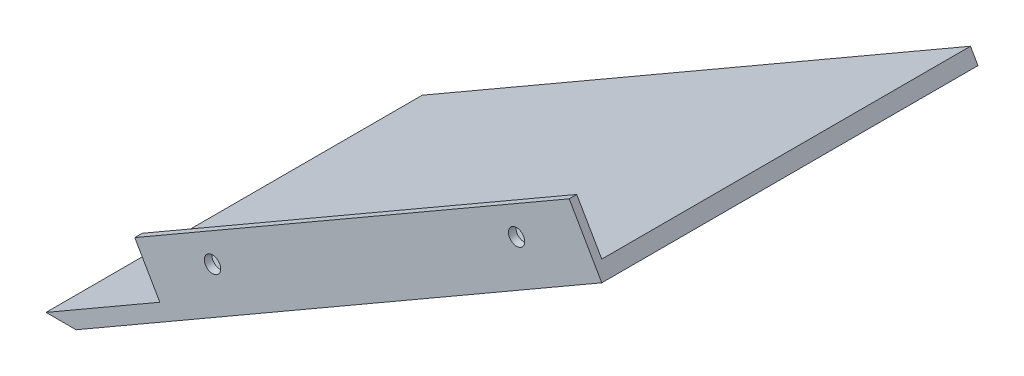
ISO-10303-21;
HEADER;
FILE_DESCRIPTION(('STEP AP214'),'2;1');
FILE_NAME('part.step','',(''),(''),'','','');
FILE_SCHEMA(('AUTOMOTIVE_DESIGN { 1 0 10303 214 1 1 1 1 }'));
ENDSEC;
DATA;
#1=APPLICATION_CONTEXT('core data for automotive mechanical design processes');
#2=APPLICATION_PROTOCOL_DEFINITION('international standard','automotive_design',2000,#1);
#3=PRODUCT_CONTEXT('',#1,'mechanical');
#4=PRODUCT('Part','Part','',(#3));
#5=PRODUCT_RELATED_PRODUCT_CATEGORY('part','',(#4));
#6=PRODUCT_DEFINITION_FORMATION('','',#4);
#7=PRODUCT_DEFINITION_CONTEXT('part definition',#1,'design');
#8=PRODUCT_DEFINITION('design','',#6,#7);
#9=PRODUCT_DEFINITION_SHAPE('','',#8);
#10=(LENGTH_UNIT() NAMED_UNIT(*) SI_UNIT(.MILLI.,.METRE.));
#11=(NAMED_UNIT(*) PLANE_ANGLE_UNIT() SI_UNIT($,.RADIAN.));
#12=(NAMED_UNIT(*) SI_UNIT($,.STERADIAN.) SOLID_ANGLE_UNIT());
#13=UNCERTAINTY_MEASURE_WITH_UNIT(LENGTH_MEASURE(1.E-05),#10,'distance_accuracy_value','');
#14=(GEOMETRIC_REPRESENTATION_CONTEXT(3) GLOBAL_UNCERTAINTY_ASSIGNED_CONTEXT((#13)) GLOBAL_UNIT_ASSIGNED_CONTEXT((#10,
#11,#12)) REPRESENTATION_CONTEXT('',''));
#15=CARTESIAN_POINT('',(0.,0.,0.));
#16=DIRECTION('',(0.,0.,1.));
#17=DIRECTION('',(1.,0.,0.));
#18=AXIS2_PLACEMENT_3D('',#15,#16,#17);
#19=CARTESIAN_POINT('',(0.,0.,75.));
#20=DIRECTION('',(0.500000000000001,-0.866025403784438,0.));
#21=DIRECTION('',(0.866025403784438,0.500000000000001,0.));
#22=AXIS2_PLACEMENT_3D('',#19,#20,#21);
#23=PLANE('',#22);
#24=DIRECTION('',(-0.866025403784438,-0.500000000000001,0.));
#25=VECTOR('',#24,1.);
#26=CARTESIAN_POINT('',(109.297734111955,63.1030762113535,73.5));
#27=LINE('',#26,#25);
#28=CARTESIAN_POINT('',(109.297734111955,63.1030762113535,73.5));
#29=VERTEX_POINT('',#28);
#30=CARTESIAN_POINT('',(22.695193733511,13.1030762113533,73.5));
#31=VERTEX_POINT('',#30);
#32=EDGE_CURVE('E155',#29,#31,#27,.T.);
#33=ORIENTED_EDGE('',*,*,#32,.F.);
#34=DIRECTION('',(0.,0.,-1.));
#35=VECTOR('',#34,1.);
#36=CARTESIAN_POINT('',(109.297734111955,63.1030762113535,75.));
#37=LINE('',#36,#35);
#38=CARTESIAN_POINT('',(109.297734111955,63.1030762113535,0.));
#39=VERTEX_POINT('',#38);
#40=EDGE_CURVE('E82',#29,#39,#37,.T.);
#41=ORIENTED_EDGE('',*,*,#40,.T.);
#42=DIRECTION('',(-0.866025403784438,-0.500000000000001,0.));
#43=VECTOR('',#42,1.);
#44=CARTESIAN_POINT('',(0.,0.,0.));
#45=LINE('',#44,#43);
#46=CARTESIAN_POINT('',(0.,0.,0.));
#47=VERTEX_POINT('',#46);
#48=EDGE_CURVE('E126',#39,#47,#45,.T.);
#49=ORIENTED_EDGE('',*,*,#48,.T.);
#50=DIRECTION('',(0.,0.,-1.));
#51=VECTOR('',#50,1.);
#52=CARTESIAN_POINT('',(0.,0.,75.));
#53=LINE('',#52,#51);
#54=CARTESIAN_POINT('',(0.,0.,75.));
#55=VERTEX_POINT('',#54);
#56=EDGE_CURVE('E11',#55,#47,#53,.T.);
#57=ORIENTED_EDGE('',*,*,#56,.F.);
#58=DIRECTION('',(-0.866025403784438,-0.500000000000001,0.));
#59=VECTOR('',#58,1.);
#60=CARTESIAN_POINT('',(0.,0.,75.));
#61=LINE('',#60,#59);
#62=CARTESIAN_POINT('',(22.695193733511,13.1030762113533,75.));
#63=VERTEX_POINT('',#62);
#64=EDGE_CURVE('E85',#63,#55,#61,.T.);
#65=ORIENTED_EDGE('',*,*,#64,.F.);
#66=DIRECTION('',(0.,0.,1.));
#67=VECTOR('',#66,1.);
#68=CARTESIAN_POINT('',(22.695193733511,13.1030762113533,75.));
#69=LINE('',#68,#67);
#70=EDGE_CURVE('E123',#31,#63,#69,.T.);
#71=ORIENTED_EDGE('',*,*,#70,.F.);
#72=EDGE_LOOP('',(#33,#41,#49,#57,#65,#71));
#73=FACE_BOUND('',#72,.T.);
#74=ADVANCED_FACE('F37',(#73),#23,.F.);
#75=CARTESIAN_POINT('',(0.,0.,75.));
#76=DIRECTION('',(0.,1.,0.));
#77=DIRECTION('',(0.,0.,1.));
#78=AXIS2_PLACEMENT_3D('',#75,#76,#77);
#79=PLANE('',#78);
#80=DIRECTION('',(1.,0.,0.));
#81=VECTOR('',#80,1.);
#82=CARTESIAN_POINT('',(0.,0.,0.));
#83=LINE('',#82,#81);
#84=CARTESIAN_POINT('',(6.,0.,0.));
#85=VERTEX_POINT('',#84);
#86=EDGE_CURVE('E128',#47,#85,#83,.T.);
#87=ORIENTED_EDGE('',*,*,#86,.T.);
#88=DIRECTION('',(0.,0.,-1.));
#89=VECTOR('',#88,1.);
#90=CARTESIAN_POINT('',(6.,0.,75.));
#91=LINE('',#90,#89);
#92=CARTESIAN_POINT('',(6.,0.,75.));
#93=VERTEX_POINT('',#92);
#94=EDGE_CURVE('E45',#93,#85,#91,.T.);
#95=ORIENTED_EDGE('',*,*,#94,.F.);
#96=DIRECTION('',(1.,0.,0.));
#97=VECTOR('',#96,1.);
#98=CARTESIAN_POINT('',(0.,0.,75.));
#99=LINE('',#98,#97);
#100=EDGE_CURVE('E134',#55,#93,#99,.T.);
#101=ORIENTED_EDGE('',*,*,#100,.F.);
#102=ORIENTED_EDGE('',*,*,#56,.T.);
#103=EDGE_LOOP('',(#87,#95,#101,#102));
#104=FACE_BOUND('',#103,.T.);
#105=ADVANCED_FACE('F173',(#104),#79,.F.);
#106=CARTESIAN_POINT('',(6.,0.,75.));
#107=DIRECTION('',(-0.500000000000001,0.866025403784438,0.));
#108=DIRECTION('',(-0.866025403784438,-0.500000000000001,0.));
#109=AXIS2_PLACEMENT_3D('',#106,#107,#108);
#110=PLANE('',#109);
#111=DIRECTION('',(0.866025403784438,0.500000000000001,0.));
#112=VECTOR('',#111,1.);
#113=CARTESIAN_POINT('',(6.,0.,0.));
#114=LINE('',#113,#112);
#115=CARTESIAN_POINT('',(110.797734111955,60.5050000000002,0.));
#116=VERTEX_POINT('',#115);
#117=EDGE_CURVE('E141',#85,#116,#114,.T.);
#118=ORIENTED_EDGE('',*,*,#117,.T.);
#119=DIRECTION('',(0.,0.,-1.));
#120=VECTOR('',#119,1.);
#121=CARTESIAN_POINT('',(110.797734111955,60.5050000000002,75.));
#122=LINE('',#121,#120);
#123=CARTESIAN_POINT('',(110.797734111955,60.5050000000002,75.));
#124=VERTEX_POINT('',#123);
#125=EDGE_CURVE('E145',#124,#116,#122,.T.);
#126=ORIENTED_EDGE('',*,*,#125,.F.);
#127=DIRECTION('',(0.866025403784438,0.500000000000001,0.));
#128=VECTOR('',#127,1.);
#129=CARTESIAN_POINT('',(6.,0.,75.));
#130=LINE('',#129,#128);
#131=EDGE_CURVE('E61',#93,#124,#130,.T.);
#132=ORIENTED_EDGE('',*,*,#131,.F.);
#133=ORIENTED_EDGE('',*,*,#94,.T.);
#134=EDGE_LOOP('',(#118,#126,#132,#133));
#135=FACE_BOUND('',#134,.T.);
#136=ADVANCED_FACE('F186',(#135),#110,.F.);
#137=CARTESIAN_POINT('',(110.797734111955,60.5050000000002,75.));
#138=DIRECTION('',(-0.866025403784434,-0.500000000000007,0.));
#139=DIRECTION('',(0.500000000000007,-0.866025403784435,0.));
#140=AXIS2_PLACEMENT_3D('',#137,#138,#139);
#141=PLANE('',#140);
#142=DIRECTION('',(-0.500000000000007,0.866025403784435,0.));
#143=VECTOR('',#142,1.);
#144=CARTESIAN_POINT('',(110.797734111955,60.5050000000002,0.));
#145=LINE('',#144,#143);
#146=EDGE_CURVE('E135',#116,#39,#145,.T.);
#147=ORIENTED_EDGE('',*,*,#146,.T.);
#148=ORIENTED_EDGE('',*,*,#40,.F.);
#149=DIRECTION('',(0.500000000000001,-0.866025403784438,0.));
#150=VECTOR('',#149,1.);
#151=CARTESIAN_POINT('',(104.297734111955,71.7633302491978,73.5));
#152=LINE('',#151,#150);
#153=CARTESIAN_POINT('',(104.297734111955,71.7633302491978,73.5));
#154=VERTEX_POINT('',#153);
#155=EDGE_CURVE('E109',#154,#29,#152,.T.);
#156=ORIENTED_EDGE('',*,*,#155,.F.);
#157=DIRECTION('',(0.,0.,-1.));
#158=VECTOR('',#157,1.);
#159=CARTESIAN_POINT('',(104.297734111955,71.7633302491978,75.));
#160=LINE('',#159,#158);
#161=CARTESIAN_POINT('',(104.297734111955,71.7633302491978,75.));
#162=VERTEX_POINT('',#161);
#163=EDGE_CURVE('E115',#162,#154,#160,.T.);
#164=ORIENTED_EDGE('',*,*,#163,.F.);
#165=DIRECTION('',(-0.500000000000007,0.866025403784435,0.));
#166=VECTOR('',#165,1.);
#167=CARTESIAN_POINT('',(110.797734111955,60.5050000000002,75.));
#168=LINE('',#167,#166);
#169=EDGE_CURVE('E138',#124,#162,#168,.T.);
#170=ORIENTED_EDGE('',*,*,#169,.F.);
#171=ORIENTED_EDGE('',*,*,#125,.T.);
#172=EDGE_LOOP('',(#147,#148,#156,#164,#170,#171));
#173=FACE_BOUND('',#172,.T.);
#174=ADVANCED_FACE('F125',(#173),#141,.F.);
#175=CARTESIAN_POINT('',(0.,0.,75.));
#176=DIRECTION('',(0.,0.,1.));
#177=DIRECTION('',(1.,0.,0.));
#178=AXIS2_PLACEMENT_3D('',#175,#176,#177);
#179=PLANE('',#178);
#180=CARTESIAN_POINT('',(33.1981389723246,24.9114414286146,75.));
#181=DIRECTION('',(0.,0.,1.));
#182=DIRECTION('',(1.,0.,0.));
#183=AXIS2_PLACEMENT_3D('',#180,#181,#182);
#184=CIRCLE('',#183,1.625);
#185=CARTESIAN_POINT('',(34.8231389723246,24.9114414286146,75.));
#186=VERTEX_POINT('',#185);
#187=EDGE_CURVE('E151',#186,#186,#184,.T.);
#188=ORIENTED_EDGE('',*,*,#187,.F.);
#189=EDGE_LOOP('',(#188));
#190=FACE_BOUND('',#189,.T.);
#191=CARTESIAN_POINT('',(93.8073530551883,59.9332032302756,75.));
#192=DIRECTION('',(0.,0.,1.));
#193=DIRECTION('',(1.,0.,0.));
#194=AXIS2_PLACEMENT_3D('',#191,#192,#193);
#195=CIRCLE('',#194,1.625);
#196=CARTESIAN_POINT('',(95.4323530551884,59.9332032302756,75.));
#197=VERTEX_POINT('',#196);
#198=EDGE_CURVE('E157',#197,#197,#195,.T.);
#199=ORIENTED_EDGE('',*,*,#198,.F.);
#200=EDGE_LOOP('',(#199));
#201=FACE_BOUND('',#200,.T.);
#202=ORIENTED_EDGE('',*,*,#169,.T.);
#203=DIRECTION('',(0.866025403784438,0.500000000000001,0.));
#204=VECTOR('',#203,1.);
#205=CARTESIAN_POINT('',(104.297734111955,71.7633302491978,75.));
#206=LINE('',#205,#204);
#207=CARTESIAN_POINT('',(17.695193733511,21.7633302491977,75.));
#208=VERTEX_POINT('',#207);
#209=EDGE_CURVE('E120',#208,#162,#206,.T.);
#210=ORIENTED_EDGE('',*,*,#209,.F.);
#211=DIRECTION('',(0.500000000000001,-0.866025403784438,0.));
#212=VECTOR('',#211,1.);
#213=CARTESIAN_POINT('',(17.695193733511,21.7633302491977,75.));
#214=LINE('',#213,#212);
#215=EDGE_CURVE('E53',#208,#63,#214,.T.);
#216=ORIENTED_EDGE('',*,*,#215,.T.);
#217=ORIENTED_EDGE('',*,*,#64,.T.);
#218=ORIENTED_EDGE('',*,*,#100,.T.);
#219=ORIENTED_EDGE('',*,*,#131,.T.);
#220=EDGE_LOOP('',(#202,#210,#216,#217,#218,#219));
#221=FACE_BOUND('',#220,.T.);
#222=ADVANCED_FACE('F175',(#190,#201,#221),#179,.T.);
#223=CARTESIAN_POINT('',(0.,0.,0.));
#224=DIRECTION('',(0.,0.,1.));
#225=DIRECTION('',(1.,0.,0.));
#226=AXIS2_PLACEMENT_3D('',#223,#224,#225);
#227=PLANE('',#226);
#228=ORIENTED_EDGE('',*,*,#48,.F.);
#229=ORIENTED_EDGE('',*,*,#146,.F.);
#230=ORIENTED_EDGE('',*,*,#117,.F.);
#231=ORIENTED_EDGE('',*,*,#86,.F.);
#232=EDGE_LOOP('',(#228,#229,#230,#231));
#233=FACE_BOUND('',#232,.T.);
#234=ADVANCED_FACE('F177',(#233),#227,.F.);
#235=CARTESIAN_POINT('',(104.297734111955,71.7633302491978,73.5));
#236=DIRECTION('',(0.,0.,1.));
#237=DIRECTION('',(1.,0.,0.));
#238=AXIS2_PLACEMENT_3D('',#235,#236,#237);
#239=PLANE('',#238);
#240=CARTESIAN_POINT('',(33.1981389723246,24.9114414286146,73.5));
#241=DIRECTION('',(0.,0.,1.));
#242=DIRECTION('',(1.,0.,0.));
#243=AXIS2_PLACEMENT_3D('',#240,#241,#242);
#244=CIRCLE('',#243,1.625);
#245=CARTESIAN_POINT('',(34.8231389723246,24.9114414286146,73.5));
#246=VERTEX_POINT('',#245);
#247=EDGE_CURVE('E40',#246,#246,#244,.T.);
#248=ORIENTED_EDGE('',*,*,#247,.T.);
#249=EDGE_LOOP('',(#248));
#250=FACE_BOUND('',#249,.T.);
#251=CARTESIAN_POINT('',(93.8073530551883,59.9332032302756,73.5));
#252=DIRECTION('',(0.,0.,1.));
#253=DIRECTION('',(1.,0.,0.));
#254=AXIS2_PLACEMENT_3D('',#251,#252,#253);
#255=CIRCLE('',#254,1.625);
#256=CARTESIAN_POINT('',(95.4323530551884,59.9332032302756,73.5));
#257=VERTEX_POINT('',#256);
#258=EDGE_CURVE('E149',#257,#257,#255,.T.);
#259=ORIENTED_EDGE('',*,*,#258,.T.);
#260=EDGE_LOOP('',(#259));
#261=FACE_BOUND('',#260,.T.);
#262=ORIENTED_EDGE('',*,*,#32,.T.);
#263=DIRECTION('',(0.500000000000001,-0.866025403784438,0.));
#264=VECTOR('',#263,1.);
#265=CARTESIAN_POINT('',(17.695193733511,21.7633302491977,73.5));
#266=LINE('',#265,#264);
#267=CARTESIAN_POINT('',(17.695193733511,21.7633302491977,73.5));
#268=VERTEX_POINT('',#267);
#269=EDGE_CURVE('E111',#268,#31,#266,.T.);
#270=ORIENTED_EDGE('',*,*,#269,.F.);
#271=DIRECTION('',(-0.866025403784438,-0.500000000000001,0.));
#272=VECTOR('',#271,1.);
#273=CARTESIAN_POINT('',(104.297734111955,71.7633302491978,73.5));
#274=LINE('',#273,#272);
#275=EDGE_CURVE('E105',#154,#268,#274,.T.);
#276=ORIENTED_EDGE('',*,*,#275,.F.);
#277=ORIENTED_EDGE('',*,*,#155,.T.);
#278=EDGE_LOOP('',(#262,#270,#276,#277));
#279=FACE_BOUND('',#278,.T.);
#280=ADVANCED_FACE('F107',(#250,#261,#279),#239,.F.);
#281=CARTESIAN_POINT('',(17.695193733511,21.7633302491977,75.));
#282=DIRECTION('',(0.866025403784438,0.500000000000001,0.));
#283=DIRECTION('',(-0.500000000000001,0.866025403784438,0.));
#284=AXIS2_PLACEMENT_3D('',#281,#282,#283);
#285=PLANE('',#284);
#286=ORIENTED_EDGE('',*,*,#70,.T.);
#287=ORIENTED_EDGE('',*,*,#215,.F.);
#288=DIRECTION('',(0.,0.,1.));
#289=VECTOR('',#288,1.);
#290=CARTESIAN_POINT('',(17.695193733511,21.7633302491977,75.));
#291=LINE('',#290,#289);
#292=EDGE_CURVE('E114',#268,#208,#291,.T.);
#293=ORIENTED_EDGE('',*,*,#292,.F.);
#294=ORIENTED_EDGE('',*,*,#269,.T.);
#295=EDGE_LOOP('',(#286,#287,#293,#294));
#296=FACE_BOUND('',#295,.T.);
#297=ADVANCED_FACE('F169',(#296),#285,.F.);
#298=CARTESIAN_POINT('',(-5.00000000000002,8.66025403784439,0.));
#299=DIRECTION('',(-0.500000000000001,0.866025403784438,0.));
#300=DIRECTION('',(-0.866025403784438,-0.500000000000001,0.));
#301=AXIS2_PLACEMENT_3D('',#298,#299,#300);
#302=PLANE('',#301);
#303=ORIENTED_EDGE('',*,*,#163,.T.);
#304=ORIENTED_EDGE('',*,*,#275,.T.);
#305=ORIENTED_EDGE('',*,*,#292,.T.);
#306=ORIENTED_EDGE('',*,*,#209,.T.);
#307=EDGE_LOOP('',(#303,#304,#305,#306));
#308=FACE_BOUND('',#307,.T.);
#309=ADVANCED_FACE('F119',(#308),#302,.T.);
#310=CARTESIAN_POINT('',(93.8073530551883,59.9332032302756,0.));
#311=DIRECTION('',(0.,0.,1.));
#312=DIRECTION('',(1.,0.,0.));
#313=AXIS2_PLACEMENT_3D('',#310,#311,#312);
#314=CYLINDRICAL_SURFACE('',#313,1.625);
#315=ORIENTED_EDGE('',*,*,#198,.T.);
#316=EDGE_LOOP('',(#315));
#317=FACE_BOUND('',#316,.T.);
#318=ORIENTED_EDGE('',*,*,#258,.F.);
#319=EDGE_LOOP('',(#318));
#320=FACE_BOUND('',#319,.T.);
#321=ADVANCED_FACE('F230',(#317,#320),#314,.F.);
#322=CARTESIAN_POINT('',(33.1981389723246,24.9114414286146,0.));
#323=DIRECTION('',(0.,0.,1.));
#324=DIRECTION('',(1.,0.,0.));
#325=AXIS2_PLACEMENT_3D('',#322,#323,#324);
#326=CYLINDRICAL_SURFACE('',#325,1.625);
#327=ORIENTED_EDGE('',*,*,#187,.T.);
#328=EDGE_LOOP('',(#327));
#329=FACE_BOUND('',#328,.T.);
#330=ORIENTED_EDGE('',*,*,#247,.F.);
#331=EDGE_LOOP('',(#330));
#332=FACE_BOUND('',#331,.T.);
#333=ADVANCED_FACE('F250',(#329,#332),#326,.F.);
#334=CLOSED_SHELL('',(#74,#105,#136,#174,#222,#234,#280,#297,#309,#321,#333));
#335=MANIFOLD_SOLID_BREP('B2',#334);
#336=ADVANCED_BREP_SHAPE_REPRESENTATION('',(#18,#335),#14);
#337=SHAPE_DEFINITION_REPRESENTATION(#9,#336);
ENDSEC;
END-ISO-10303-21;
